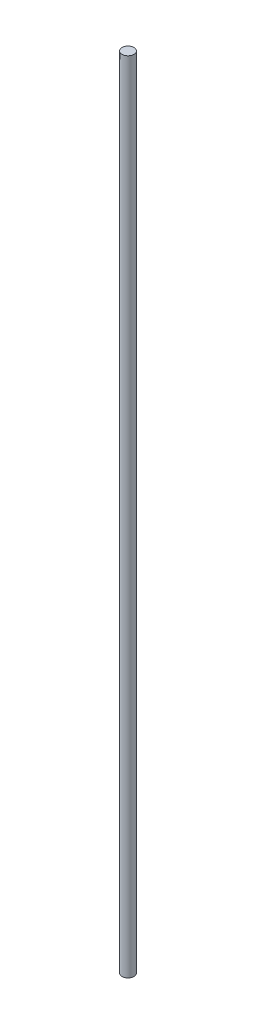
ISO-10303-21;
HEADER;
FILE_DESCRIPTION(('STEP AP214'),'2;1');
FILE_NAME('part.step','',(''),(''),'','','');
FILE_SCHEMA(('AUTOMOTIVE_DESIGN { 1 0 10303 214 1 1 1 1 }'));
ENDSEC;
DATA;
#1=APPLICATION_CONTEXT('core data for automotive mechanical design processes');
#2=APPLICATION_PROTOCOL_DEFINITION('international standard','automotive_design',2000,#1);
#3=PRODUCT_CONTEXT('',#1,'mechanical');
#4=PRODUCT('Part','Part','',(#3));
#5=PRODUCT_RELATED_PRODUCT_CATEGORY('part','',(#4));
#6=PRODUCT_DEFINITION_FORMATION('','',#4);
#7=PRODUCT_DEFINITION_CONTEXT('part definition',#1,'design');
#8=PRODUCT_DEFINITION('design','',#6,#7);
#9=PRODUCT_DEFINITION_SHAPE('','',#8);
#10=(LENGTH_UNIT() NAMED_UNIT(*) SI_UNIT(.MILLI.,.METRE.));
#11=(NAMED_UNIT(*) PLANE_ANGLE_UNIT() SI_UNIT($,.RADIAN.));
#12=(NAMED_UNIT(*) SI_UNIT($,.STERADIAN.) SOLID_ANGLE_UNIT());
#13=UNCERTAINTY_MEASURE_WITH_UNIT(LENGTH_MEASURE(1.E-05),#10,'distance_accuracy_value','');
#14=(GEOMETRIC_REPRESENTATION_CONTEXT(3) GLOBAL_UNCERTAINTY_ASSIGNED_CONTEXT((#13)) GLOBAL_UNIT_ASSIGNED_CONTEXT((#10,
#11,#12)) REPRESENTATION_CONTEXT('',''));
#15=CARTESIAN_POINT('',(0.,0.,0.));
#16=DIRECTION('',(0.,0.,1.));
#17=DIRECTION('',(1.,0.,0.));
#18=AXIS2_PLACEMENT_3D('',#15,#16,#17);
#19=CARTESIAN_POINT('',(0.,100.,0.));
#20=DIRECTION('',(0.,-1.,0.));
#21=DIRECTION('',(0.,0.,-1.));
#22=AXIS2_PLACEMENT_3D('',#19,#20,#21);
#23=CYLINDRICAL_SURFACE('',#22,1.5);
#24=CARTESIAN_POINT('',(0.,100.,0.));
#25=DIRECTION('',(0.,1.,0.));
#26=DIRECTION('',(0.,0.,1.));
#27=AXIS2_PLACEMENT_3D('',#24,#25,#26);
#28=CIRCLE('',#27,1.5);
#29=CARTESIAN_POINT('',(0.,100.,1.5));
#30=VERTEX_POINT('',#29);
#31=EDGE_CURVE('E10',#30,#30,#28,.T.);
#32=ORIENTED_EDGE('',*,*,#31,.F.);
#33=EDGE_LOOP('',(#32));
#34=FACE_BOUND('',#33,.T.);
#35=CARTESIAN_POINT('',(0.,-100.,0.));
#36=DIRECTION('',(0.,1.,0.));
#37=DIRECTION('',(0.,0.,1.));
#38=AXIS2_PLACEMENT_3D('',#35,#36,#37);
#39=CIRCLE('',#38,1.5);
#40=CARTESIAN_POINT('',(0.,-100.,1.5));
#41=VERTEX_POINT('',#40);
#42=EDGE_CURVE('E40',#41,#41,#39,.T.);
#43=ORIENTED_EDGE('',*,*,#42,.T.);
#44=EDGE_LOOP('',(#43));
#45=FACE_BOUND('',#44,.T.);
#46=ADVANCED_FACE('F37',(#34,#45),#23,.T.);
#47=CARTESIAN_POINT('',(0.,100.,0.));
#48=DIRECTION('',(0.,1.,0.));
#49=DIRECTION('',(0.,0.,1.));
#50=AXIS2_PLACEMENT_3D('',#47,#48,#49);
#51=PLANE('',#50);
#52=ORIENTED_EDGE('',*,*,#31,.T.);
#53=EDGE_LOOP('',(#52));
#54=FACE_BOUND('',#53,.T.);
#55=ADVANCED_FACE('F54',(#54),#51,.T.);
#56=CARTESIAN_POINT('',(0.,-100.,0.));
#57=DIRECTION('',(0.,1.,0.));
#58=DIRECTION('',(0.,0.,1.));
#59=AXIS2_PLACEMENT_3D('',#56,#57,#58);
#60=PLANE('',#59);
#61=ORIENTED_EDGE('',*,*,#42,.F.);
#62=EDGE_LOOP('',(#61));
#63=FACE_BOUND('',#62,.T.);
#64=ADVANCED_FACE('F52',(#63),#60,.F.);
#65=CLOSED_SHELL('',(#46,#55,#64));
#66=MANIFOLD_SOLID_BREP('B2',#65);
#67=ADVANCED_BREP_SHAPE_REPRESENTATION('',(#18,#66),#14);
#68=SHAPE_DEFINITION_REPRESENTATION(#9,#67);
ENDSEC;
END-ISO-10303-21;
